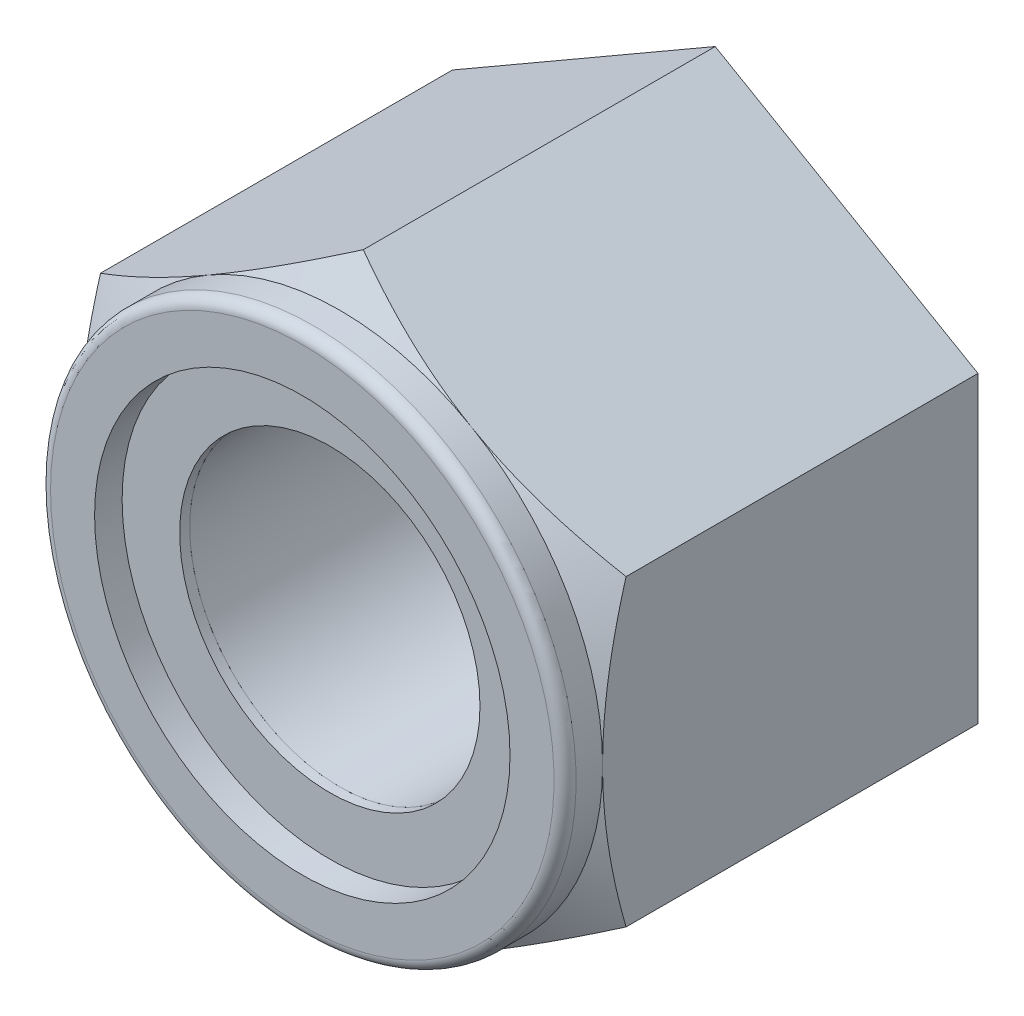
ISO-10303-21;
HEADER;
FILE_DESCRIPTION(('STEP AP214'),'2;1');
FILE_NAME('part.step','',(''),(''),'','','');
FILE_SCHEMA(('AUTOMOTIVE_DESIGN { 1 0 10303 214 1 1 1 1 }'));
ENDSEC;
DATA;
#1=APPLICATION_CONTEXT('core data for automotive mechanical design processes');
#2=APPLICATION_PROTOCOL_DEFINITION('international standard','automotive_design',2000,#1);
#3=PRODUCT_CONTEXT('',#1,'mechanical');
#4=PRODUCT('Part','Part','',(#3));
#5=PRODUCT_RELATED_PRODUCT_CATEGORY('part','',(#4));
#6=PRODUCT_DEFINITION_FORMATION('','',#4);
#7=PRODUCT_DEFINITION_CONTEXT('part definition',#1,'design');
#8=PRODUCT_DEFINITION('design','',#6,#7);
#9=PRODUCT_DEFINITION_SHAPE('','',#8);
#10=(LENGTH_UNIT() NAMED_UNIT(*) SI_UNIT(.MILLI.,.METRE.));
#11=(NAMED_UNIT(*) PLANE_ANGLE_UNIT() SI_UNIT($,.RADIAN.));
#12=(NAMED_UNIT(*) SI_UNIT($,.STERADIAN.) SOLID_ANGLE_UNIT());
#13=UNCERTAINTY_MEASURE_WITH_UNIT(LENGTH_MEASURE(1.E-05),#10,'distance_accuracy_value','');
#14=(GEOMETRIC_REPRESENTATION_CONTEXT(3) GLOBAL_UNCERTAINTY_ASSIGNED_CONTEXT((#13)) GLOBAL_UNIT_ASSIGNED_CONTEXT((#10,
#11,#12)) REPRESENTATION_CONTEXT('',''));
#15=CARTESIAN_POINT('',(0.,0.,0.));
#16=DIRECTION('',(0.,0.,1.));
#17=DIRECTION('',(1.,0.,0.));
#18=AXIS2_PLACEMENT_3D('',#15,#16,#17);
#19=CARTESIAN_POINT('',(0.,0.,13.9957383242047));
#20=DIRECTION('',(0.,0.,-1.));
#21=DIRECTION('',(-1.,0.,0.));
#22=AXIS2_PLACEMENT_3D('',#19,#20,#21);
#23=CYLINDRICAL_SURFACE('',#22,3.13333333333333);
#24=CARTESIAN_POINT('',(0.,0.,5.));
#25=DIRECTION('',(0.,0.,1.));
#26=DIRECTION('',(1.,0.,0.));
#27=AXIS2_PLACEMENT_3D('',#24,#25,#26);
#28=CIRCLE('',#27,3.13333333333333);
#29=CARTESIAN_POINT('',(3.13333333333333,0.,5.));
#30=VERTEX_POINT('',#29);
#31=EDGE_CURVE('E61',#30,#30,#28,.T.);
#32=ORIENTED_EDGE('',*,*,#31,.T.);
#33=EDGE_LOOP('',(#32));
#34=FACE_BOUND('',#33,.T.);
#35=CARTESIAN_POINT('',(0.,0.,5.13333333333333));
#36=DIRECTION('',(0.,0.,1.));
#37=DIRECTION('',(1.,0.,0.));
#38=AXIS2_PLACEMENT_3D('',#35,#36,#37);
#39=CIRCLE('',#38,3.13333333333333);
#40=CARTESIAN_POINT('',(3.13333333333333,0.,5.13333333333333));
#41=VERTEX_POINT('',#40);
#42=EDGE_CURVE('E11',#41,#41,#39,.T.);
#43=ORIENTED_EDGE('',*,*,#42,.F.);
#44=EDGE_LOOP('',(#43));
#45=FACE_BOUND('',#44,.T.);
#46=ADVANCED_FACE('F53',(#34,#45),#23,.T.);
#47=CARTESIAN_POINT('',(0.,0.,5.));
#48=DIRECTION('',(0.,0.,1.));
#49=DIRECTION('',(1.,0.,0.));
#50=AXIS2_PLACEMENT_3D('',#47,#48,#49);
#51=PLANE('',#50);
#52=ORIENTED_EDGE('',*,*,#31,.F.);
#53=EDGE_LOOP('',(#52));
#54=FACE_BOUND('',#53,.T.);
#55=CARTESIAN_POINT('',(0.,0.,5.));
#56=DIRECTION('',(0.,0.,1.));
#57=DIRECTION('',(1.,0.,0.));
#58=AXIS2_PLACEMENT_3D('',#55,#56,#57);
#59=CIRCLE('',#58,2.);
#60=CARTESIAN_POINT('',(2.,0.,5.));
#61=VERTEX_POINT('',#60);
#62=EDGE_CURVE('E68',#61,#61,#59,.T.);
#63=ORIENTED_EDGE('',*,*,#62,.T.);
#64=EDGE_LOOP('',(#63));
#65=FACE_BOUND('',#64,.T.);
#66=ADVANCED_FACE('F84',(#54,#65),#51,.F.);
#67=CARTESIAN_POINT('',(0.,0.,13.9957383242047));
#68=DIRECTION('',(0.,0.,-1.));
#69=DIRECTION('',(-1.,0.,0.));
#70=AXIS2_PLACEMENT_3D('',#67,#68,#69);
#71=CYLINDRICAL_SURFACE('',#70,2.);
#72=ORIENTED_EDGE('',*,*,#62,.F.);
#73=EDGE_LOOP('',(#72));
#74=FACE_BOUND('',#73,.T.);
#75=CARTESIAN_POINT('',(0.,0.,5.13333333333333));
#76=DIRECTION('',(0.,0.,1.));
#77=DIRECTION('',(1.,0.,0.));
#78=AXIS2_PLACEMENT_3D('',#75,#76,#77);
#79=CIRCLE('',#78,2.);
#80=CARTESIAN_POINT('',(2.,0.,5.13333333333333));
#81=VERTEX_POINT('',#80);
#82=EDGE_CURVE('E56',#81,#81,#79,.T.);
#83=ORIENTED_EDGE('',*,*,#82,.T.);
#84=EDGE_LOOP('',(#83));
#85=FACE_BOUND('',#84,.T.);
#86=ADVANCED_FACE('F77',(#74,#85),#71,.F.);
#87=CARTESIAN_POINT('',(2.76666666666667,0.,5.13333333333333));
#88=DIRECTION('',(0.,0.,1.));
#89=DIRECTION('',(1.,0.,0.));
#90=AXIS2_PLACEMENT_3D('',#87,#88,#89);
#91=PLANE('',#90);
#92=ORIENTED_EDGE('',*,*,#82,.F.);
#93=EDGE_LOOP('',(#92));
#94=FACE_BOUND('',#93,.T.);
#95=ORIENTED_EDGE('',*,*,#42,.T.);
#96=EDGE_LOOP('',(#95));
#97=FACE_BOUND('',#96,.T.);
#98=ADVANCED_FACE('F79',(#94,#97),#91,.T.);
#99=CLOSED_SHELL('',(#46,#66,#86,#98));
#100=MANIFOLD_SOLID_BREP('B2',#99);
#101=CARTESIAN_POINT('',(3.5,2.02072594216369,5.));
#102=DIRECTION('',(-0.5,-0.866025403784439,0.));
#103=DIRECTION('',(0.866025403784439,-0.5,0.));
#104=AXIS2_PLACEMENT_3D('',#101,#102,#103);
#105=PLANE('',#104);
#106=CARTESIAN_POINT('',(3.5002,2.02061047210985,4.68732593930663));
#107=CARTESIAN_POINT('',(3.34639282154755,2.10941108799267,4.73861421101002));
#108=CARTESIAN_POINT('',(3.19125798916558,2.19897822522909,4.78525904618381));
#109=CARTESIAN_POINT('',(2.87830199342322,2.37966345361545,4.86667812446665));
#110=CARTESIAN_POINT('',(2.7204752692125,2.47078475532382,4.90142356441544));
#111=CARTESIAN_POINT('',(2.40677778961987,2.65189807961073,4.95550997281716));
#112=CARTESIAN_POINT('',(2.25095530083931,2.74186223545399,4.97521091373962));
#113=CARTESIAN_POINT('',(1.93857711279463,2.92221386641055,4.99872986726275));
#114=CARTESIAN_POINT('',(1.78202254896577,3.01260068598001,5.00256735545443));
#115=CARTESIAN_POINT('',(1.48949078007901,3.1814939814933,4.99458469812302));
#116=CARTESIAN_POINT('',(1.3534697875421,3.26002573814993,4.98472456593039));
#117=CARTESIAN_POINT('',(1.08231397971101,3.41657761679354,4.9534735331006));
#118=CARTESIAN_POINT('',(0.947180102315319,3.49459719728457,4.9320719567142));
#119=CARTESIAN_POINT('',(0.675465207594818,3.65147186489429,4.87856959211942));
#120=CARTESIAN_POINT('',(0.538918580721666,3.73030709667644,4.84624200555491));
#121=CARTESIAN_POINT('',(0.2678619070555,3.88680174018324,4.77287106619201));
#122=CARTESIAN_POINT('',(0.133348387531464,3.96446315689009,4.73184495343014));
#123=CARTESIAN_POINT('',(-0.000199999999999256,4.04156735438122,4.68732593930663));
#124=B_SPLINE_CURVE_WITH_KNOTS('',3,(#106,#107,#108,#109,#110,#111,#112,#113,#114,#115,#116,
#117,#118,#119,#120,#121,#122,#123),.UNSPECIFIED.,.F.,.F.,(4,2,2,2,2,2,2,2,4),(0.,
0.554793832886253,1.11092123814983,1.65328467083218,2.19498204478403,2.66665130850859,
3.13875761298267,3.62133612600509,4.10296698719187),.UNSPECIFIED.);
#125=CARTESIAN_POINT('',(3.5,2.02072594216369,4.68739260883036));
#126=VERTEX_POINT('',#125);
#127=CARTESIAN_POINT('',(1.75,3.03108891324553,5.));
#128=VERTEX_POINT('',#127);
#129=EDGE_CURVE('E191',#126,#128,#124,.T.);
#130=ORIENTED_EDGE('',*,*,#129,.F.);
#131=DIRECTION('',(0.,0.,-1.));
#132=VECTOR('',#131,1.);
#133=CARTESIAN_POINT('',(3.5,2.02072594216369,5.));
#134=LINE('',#133,#132);
#135=CARTESIAN_POINT('',(3.5,2.02072594216369,0.));
#136=VERTEX_POINT('',#135);
#137=EDGE_CURVE('E139',#126,#136,#134,.T.);
#138=ORIENTED_EDGE('',*,*,#137,.T.);
#139=DIRECTION('',(-0.866025403784438,0.5,0.));
#140=VECTOR('',#139,1.);
#141=CARTESIAN_POINT('',(3.5,2.02072594216369,0.));
#142=LINE('',#141,#140);
#143=CARTESIAN_POINT('',(0.,4.04145188432738,0.));
#144=VERTEX_POINT('',#143);
#145=EDGE_CURVE('E214',#136,#144,#142,.T.);
#146=ORIENTED_EDGE('',*,*,#145,.T.);
#147=DIRECTION('',(0.,0.,-1.));
#148=VECTOR('',#147,1.);
#149=CARTESIAN_POINT('',(0.,4.04145188432738,5.));
#150=LINE('',#149,#148);
#151=CARTESIAN_POINT('',(0.,4.04145188432738,4.68739260883036));
#152=VERTEX_POINT('',#151);
#153=EDGE_CURVE('E192',#152,#144,#150,.T.);
#154=ORIENTED_EDGE('',*,*,#153,.F.);
#155=EDGE_CURVE('E188',#128,#152,#124,.T.);
#156=ORIENTED_EDGE('',*,*,#155,.F.);
#157=EDGE_LOOP('',(#130,#138,#146,#154,#156));
#158=FACE_BOUND('',#157,.T.);
#159=ADVANCED_FACE('F115',(#158),#105,.F.);
#160=CARTESIAN_POINT('',(0.,4.04145188432738,5.));
#161=DIRECTION('',(0.5,-0.866025403784439,0.));
#162=DIRECTION('',(0.866025403784439,0.5,0.));
#163=AXIS2_PLACEMENT_3D('',#160,#161,#162);
#164=PLANE('',#163);
#165=CARTESIAN_POINT('',(0.000200000000000673,4.04156735438122,4.68732593930663));
#166=CARTESIAN_POINT('',(-0.153607178452449,3.9527667384984,4.73861421101002));
#167=CARTESIAN_POINT('',(-0.308742010834423,3.86319960126198,4.78525904618381));
#168=CARTESIAN_POINT('',(-0.62169800657678,3.68251437287562,4.86667812446665));
#169=CARTESIAN_POINT('',(-0.779524730787494,3.59139307116725,4.90142356441544));
#170=CARTESIAN_POINT('',(-1.09322221038013,3.41027974688034,4.95550997281716));
#171=CARTESIAN_POINT('',(-1.24904469916069,3.32031559103708,4.97521091373962));
#172=CARTESIAN_POINT('',(-1.56142288720537,3.13996396008052,4.99872986726275));
#173=CARTESIAN_POINT('',(-1.71797745103423,3.04957714051106,5.00256735545444));
#174=CARTESIAN_POINT('',(-2.01050921992099,2.88068384499777,4.99458469812302));
#175=CARTESIAN_POINT('',(-2.1465302124579,2.80215208834115,4.98472456593039));
#176=CARTESIAN_POINT('',(-2.41768602028899,2.64560020969754,4.9534735331006));
#177=CARTESIAN_POINT('',(-2.55281989768468,2.5675806292065,4.9320719567142));
#178=CARTESIAN_POINT('',(-2.82453479240518,2.41070596159679,4.87856959211943));
#179=CARTESIAN_POINT('',(-2.96108141927834,2.33187072981464,4.84624200555492));
#180=CARTESIAN_POINT('',(-3.2321380929445,2.17537608630783,4.77287106619201));
#181=CARTESIAN_POINT('',(-3.36665161246854,2.09771466960098,4.73184495343014));
#182=CARTESIAN_POINT('',(-3.5002,2.02061047210985,4.68732593930663));
#183=B_SPLINE_CURVE_WITH_KNOTS('',3,(#165,#166,#167,#168,#169,#170,#171,#172,#173,#174,#175,
#176,#177,#178,#179,#180,#181,#182),.UNSPECIFIED.,.F.,.F.,(4,2,2,2,2,2,2,2,4),(0.,
0.554793832886252,1.11092123814983,1.65328467083218,2.19498204478403,2.6666513085086,
3.13875761298267,3.62133612600509,4.10296698719187),.UNSPECIFIED.);
#184=CARTESIAN_POINT('',(-1.75,3.03108891324554,5.));
#185=VERTEX_POINT('',#184);
#186=EDGE_CURVE('E196',#152,#185,#183,.T.);
#187=ORIENTED_EDGE('',*,*,#186,.F.);
#188=ORIENTED_EDGE('',*,*,#153,.T.);
#189=DIRECTION('',(-0.866025403784439,-0.5,0.));
#190=VECTOR('',#189,1.);
#191=CARTESIAN_POINT('',(0.,4.04145188432738,0.));
#192=LINE('',#191,#190);
#193=CARTESIAN_POINT('',(-3.5,2.02072594216369,0.));
#194=VERTEX_POINT('',#193);
#195=EDGE_CURVE('E266',#144,#194,#192,.T.);
#196=ORIENTED_EDGE('',*,*,#195,.T.);
#197=DIRECTION('',(0.,0.,-1.));
#198=VECTOR('',#197,1.);
#199=CARTESIAN_POINT('',(-3.5,2.02072594216369,5.));
#200=LINE('',#199,#198);
#201=CARTESIAN_POINT('',(-3.5,2.02072594216369,4.68739260883036));
#202=VERTEX_POINT('',#201);
#203=EDGE_CURVE('E232',#202,#194,#200,.T.);
#204=ORIENTED_EDGE('',*,*,#203,.F.);
#205=EDGE_CURVE('E276',#185,#202,#183,.T.);
#206=ORIENTED_EDGE('',*,*,#205,.F.);
#207=EDGE_LOOP('',(#187,#188,#196,#204,#206));
#208=FACE_BOUND('',#207,.T.);
#209=ADVANCED_FACE('F332',(#208),#164,.F.);
#210=CARTESIAN_POINT('',(-3.5,2.02072594216369,5.));
#211=DIRECTION('',(1.,0.,0.));
#212=DIRECTION('',(0.,0.,-1.));
#213=AXIS2_PLACEMENT_3D('',#210,#211,#212);
#214=PLANE('',#213);
#215=CARTESIAN_POINT('',(-3.5,-5.42832118913325,3.29171039145005));
#216=CARTESIAN_POINT('',(-3.5,-5.27545296559796,3.36586681134376));
#217=CARTESIAN_POINT('',(-3.5,-5.12223387181038,3.43931232069952));
#218=CARTESIAN_POINT('',(-3.5,-4.81490736341447,3.58438170980516));
#219=CARTESIAN_POINT('',(-3.5,-4.66079981349271,3.65600530257477));
#220=CARTESIAN_POINT('',(-3.5,-4.35071597154945,3.79739131146016));
#221=CARTESIAN_POINT('',(-3.5,-4.19473407359317,3.86714147525076));
#222=CARTESIAN_POINT('',(-3.5,-3.88152983040295,4.00378804742818));
#223=CARTESIAN_POINT('',(-3.5,-3.72430754417264,4.07068459059961));
#224=CARTESIAN_POINT('',(-3.5,-3.40328935619205,4.20296515879934));
#225=CARTESIAN_POINT('',(-3.5,-3.23944464294745,4.2682313748369));
#226=CARTESIAN_POINT('',(-3.5,-2.90983843166277,4.39382518009215));
#227=CARTESIAN_POINT('',(-3.5,-2.74407672088104,4.45415221505661));
#228=CARTESIAN_POINT('',(-3.5,-2.4106830047955,4.56828423611488));
#229=CARTESIAN_POINT('',(-3.5,-2.24305556435996,4.62210242283747));
#230=CARTESIAN_POINT('',(-3.5,-1.90539605132121,4.72148999156981));
#231=CARTESIAN_POINT('',(-3.5,-1.73536475427334,4.7670619714017));
#232=CARTESIAN_POINT('',(-3.5,-1.3937488255673,4.84752681416907));
#233=CARTESIAN_POINT('',(-3.5,-1.2221781450605,4.88247781632996));
#234=CARTESIAN_POINT('',(-3.5,-0.876902520257989,4.93972691489234));
#235=CARTESIAN_POINT('',(-3.5,-0.703197778969184,4.96202620543696));
#236=CARTESIAN_POINT('',(-3.5,-0.356790549769858,4.99190119436236));
#237=CARTESIAN_POINT('',(-3.5,-0.184104797554878,4.99966616694187));
#238=CARTESIAN_POINT('',(-3.5,0.161308535217046,5.00031240227325));
#239=CARTESIAN_POINT('',(-3.5,0.334036116477546,4.99319339435635));
#240=CARTESIAN_POINT('',(-3.5,0.627267326173035,4.96897680945658));
#241=CARTESIAN_POINT('',(-3.5,0.748084592119676,4.95545973305487));
#242=CARTESIAN_POINT('',(-3.5,0.988829654945528,4.92198482243021));
#243=CARTESIAN_POINT('',(-3.5,1.10875732862451,4.90202611252953));
#244=CARTESIAN_POINT('',(-3.5,1.46704957292925,4.83353706741905));
#245=CARTESIAN_POINT('',(-3.5,1.70378822015516,4.7764064562308));
#246=CARTESIAN_POINT('',(-3.5,2.05776701423679,4.67740724469126));
#247=CARTESIAN_POINT('',(-3.5,2.17684391874892,4.64173259939028));
#248=CARTESIAN_POINT('',(-3.5,2.41384088896862,4.56669445557482));
#249=CARTESIAN_POINT('',(-3.5,2.53176094710896,4.52733093294823));
#250=CARTESIAN_POINT('',(-3.5,2.766481805821,4.44554533760541));
#251=CARTESIAN_POINT('',(-3.5,2.88328296524103,4.40312428541469));
#252=CARTESIAN_POINT('',(-3.5,3.11591877969283,4.31572104522802));
#253=CARTESIAN_POINT('',(-3.5,3.23175344542175,4.27073888562164));
#254=CARTESIAN_POINT('',(-3.5,3.50250396629017,4.16270144014859));
#255=CARTESIAN_POINT('',(-3.5,3.65707293002751,4.09877848349487));
#256=CARTESIAN_POINT('',(-3.5,3.96491389227385,3.96787401451323));
#257=CARTESIAN_POINT('',(-3.5,4.11818581545299,3.900892325965));
#258=CARTESIAN_POINT('',(-3.5,4.42366804952573,3.76447749635459));
#259=CARTESIAN_POINT('',(-3.5,4.57587814642353,3.69504387731232));
#260=CARTESIAN_POINT('',(-3.5,4.87938544499878,3.55420636139757));
#261=CARTESIAN_POINT('',(-3.5,5.03068262745959,3.48280242322544));
#262=CARTESIAN_POINT('',(-3.5,5.48372223978274,3.2660644548937));
#263=CARTESIAN_POINT('',(-3.5,5.7843190764,3.11833722055126));
#264=CARTESIAN_POINT('',(-3.5,6.38334266368291,2.81854820970694));
#265=CARTESIAN_POINT('',(-3.5,6.68176933504329,2.66648627578943));
#266=CARTESIAN_POINT('',(-3.5,7.25244094865376,2.37196445508918));
#267=CARTESIAN_POINT('',(-3.5,7.52481228087437,2.2297490067426));
#268=CARTESIAN_POINT('',(-3.5,8.06853467836357,1.94336175742024));
#269=CARTESIAN_POINT('',(-3.5,8.33988570841331,1.79918988969018));
#270=CARTESIAN_POINT('',(-3.5,8.88112631398284,1.50970630064993));
#271=CARTESIAN_POINT('',(-3.5,9.15101784013932,1.36439822166078));
#272=CARTESIAN_POINT('',(-3.5,9.69014679451159,1.07260789440721));
#273=CARTESIAN_POINT('',(-3.5,9.95938425738873,0.926125710213653));
#274=CARTESIAN_POINT('',(-3.5,10.22838027119,0.779204680695816));
#275=B_SPLINE_CURVE_WITH_KNOTS('',3,(#215,#216,#217,#218,#219,#220,#221,#222,#223,#224,#225,
#226,#227,#228,#229,#230,#231,#232,#233,#234,#235,#236,#237,#238,#239,#240,#241,#242,#243,#244,
#245,#246,#247,#248,#249,#250,#251,#252,#253,#254,#255,#256,#257,#258,#259,#260,#261,#262,#263,
#264,#265,#266,#267,#268,#269,#270,#271,#272,#273,#274),.UNSPECIFIED.,.F.,.F.,(4,2,2,2,2,2,2,2,
2,2,2,2,2,2,2,2,2,2,2,2,2,2,2,2,2,2,2,2,2,4),(0.,0.50972263313,1.01952506448884,
1.53210235091663,2.04465539999535,2.57369018196405,3.10278424875902,3.6307865927486,
4.15862230820676,4.68351432474782,5.20835679064084,5.72631558241929,6.24428379348549,
6.60882010576362,6.97340599411287,7.70298313355719,8.07586982851781,8.44875896099962,
8.82152420385834,9.19428531546514,9.69603737941263,10.1978183869632,10.6996977577758,
11.2015876564367,12.2063342834818,13.2111174447338,14.1328999845748,15.0547140557038,
15.9742775321602,16.8937911651733),.UNSPECIFIED.);
#276=CARTESIAN_POINT('',(-3.5,0.,5.));
#277=VERTEX_POINT('',#276);
#278=EDGE_CURVE('E326',#202,#277,#275,.F.);
#279=ORIENTED_EDGE('',*,*,#278,.F.);
#280=ORIENTED_EDGE('',*,*,#203,.T.);
#281=DIRECTION('',(0.,-1.,0.));
#282=VECTOR('',#281,1.);
#283=CARTESIAN_POINT('',(-3.5,2.02072594216369,0.));
#284=LINE('',#283,#282);
#285=CARTESIAN_POINT('',(-3.5,-2.02072594216369,0.));
#286=VERTEX_POINT('',#285);
#287=EDGE_CURVE('E262',#194,#286,#284,.T.);
#288=ORIENTED_EDGE('',*,*,#287,.T.);
#289=DIRECTION('',(0.,0.,-1.));
#290=VECTOR('',#289,1.);
#291=CARTESIAN_POINT('',(-3.5,-2.02072594216369,5.));
#292=LINE('',#291,#290);
#293=CARTESIAN_POINT('',(-3.5,-2.02072594216369,4.68739260883036));
#294=VERTEX_POINT('',#293);
#295=EDGE_CURVE('E238',#294,#286,#292,.T.);
#296=ORIENTED_EDGE('',*,*,#295,.F.);
#297=EDGE_CURVE('E319',#277,#294,#275,.F.);
#298=ORIENTED_EDGE('',*,*,#297,.F.);
#299=EDGE_LOOP('',(#279,#280,#288,#296,#298));
#300=FACE_BOUND('',#299,.T.);
#301=ADVANCED_FACE('F328',(#300),#214,.F.);
#302=CARTESIAN_POINT('',(-3.5,-2.02072594216369,5.));
#303=DIRECTION('',(0.5,0.866025403784439,0.));
#304=DIRECTION('',(-0.866025403784439,0.5,0.));
#305=AXIS2_PLACEMENT_3D('',#302,#303,#304);
#306=PLANE('',#305);
#307=CARTESIAN_POINT('',(-3.5002,-2.02061047210985,4.68732593930663));
#308=CARTESIAN_POINT('',(-3.34639282154755,-2.10941108799267,4.73861421101002));
#309=CARTESIAN_POINT('',(-3.19125798916558,-2.19897822522909,4.78525904618381));
#310=CARTESIAN_POINT('',(-2.87830199342322,-2.37966345361545,4.86667812446665));
#311=CARTESIAN_POINT('',(-2.72047526921251,-2.47078475532382,4.90142356441544));
#312=CARTESIAN_POINT('',(-2.40677778961987,-2.65189807961074,4.95550997281716));
#313=CARTESIAN_POINT('',(-2.25095530083931,-2.74186223545399,4.97521091373962));
#314=CARTESIAN_POINT('',(-1.93857711279463,-2.92221386641056,4.99872986726275));
#315=CARTESIAN_POINT('',(-1.78202254896577,-3.01260068598001,5.00256735545443));
#316=CARTESIAN_POINT('',(-1.48949078007901,-3.1814939814933,4.99458469812302));
#317=CARTESIAN_POINT('',(-1.3534697875421,-3.26002573814993,4.98472456593039));
#318=CARTESIAN_POINT('',(-1.08231397971101,-3.41657761679354,4.9534735331006));
#319=CARTESIAN_POINT('',(-0.947180102315319,-3.49459719728458,4.9320719567142));
#320=CARTESIAN_POINT('',(-0.675465207594817,-3.65147186489429,4.87856959211942));
#321=CARTESIAN_POINT('',(-0.538918580721665,-3.73030709667644,4.84624200555491));
#322=CARTESIAN_POINT('',(-0.267861907055499,-3.88680174018324,4.77287106619201));
#323=CARTESIAN_POINT('',(-0.133348387531464,-3.96446315689009,4.73184495343014));
#324=CARTESIAN_POINT('',(0.000199999999999431,-4.04156735438122,4.68732593930663));
#325=B_SPLINE_CURVE_WITH_KNOTS('',3,(#307,#308,#309,#310,#311,#312,#313,#314,#315,#316,#317,
#318,#319,#320,#321,#322,#323,#324),.UNSPECIFIED.,.F.,.F.,(4,2,2,2,2,2,2,2,4),(0.,
0.554793832886253,1.11092123814983,1.65328467083218,2.19498204478403,2.6666513085086,
3.13875761298267,3.62133612600509,4.10296698719187),.UNSPECIFIED.);
#326=CARTESIAN_POINT('',(-1.75,-3.03108891324553,5.));
#327=VERTEX_POINT('',#326);
#328=EDGE_CURVE('E327',#294,#327,#325,.T.);
#329=ORIENTED_EDGE('',*,*,#328,.F.);
#330=ORIENTED_EDGE('',*,*,#295,.T.);
#331=DIRECTION('',(0.866025403784439,-0.5,0.));
#332=VECTOR('',#331,1.);
#333=CARTESIAN_POINT('',(-3.5,-2.02072594216369,0.));
#334=LINE('',#333,#332);
#335=CARTESIAN_POINT('',(0.,-4.04145188432738,0.));
#336=VERTEX_POINT('',#335);
#337=EDGE_CURVE('E258',#286,#336,#334,.T.);
#338=ORIENTED_EDGE('',*,*,#337,.T.);
#339=DIRECTION('',(0.,0.,-1.));
#340=VECTOR('',#339,1.);
#341=CARTESIAN_POINT('',(0.,-4.04145188432738,5.));
#342=LINE('',#341,#340);
#343=CARTESIAN_POINT('',(0.,-4.04145188432738,4.68739260883036));
#344=VERTEX_POINT('',#343);
#345=EDGE_CURVE('E243',#344,#336,#342,.T.);
#346=ORIENTED_EDGE('',*,*,#345,.F.);
#347=EDGE_CURVE('E313',#327,#344,#325,.T.);
#348=ORIENTED_EDGE('',*,*,#347,.F.);
#349=EDGE_LOOP('',(#329,#330,#338,#346,#348));
#350=FACE_BOUND('',#349,.T.);
#351=ADVANCED_FACE('F331',(#350),#306,.F.);
#352=CARTESIAN_POINT('',(0.,-4.04145188432738,5.));
#353=DIRECTION('',(-0.5,0.866025403784439,0.));
#354=DIRECTION('',(-0.866025403784439,-0.5,0.));
#355=AXIS2_PLACEMENT_3D('',#352,#353,#354);
#356=PLANE('',#355);
#357=CARTESIAN_POINT('',(-0.000200000000001014,-4.04156735438122,4.68732593930663));
#358=CARTESIAN_POINT('',(0.153607178452449,-3.9527667384984,4.73861421101002));
#359=CARTESIAN_POINT('',(0.308742010834423,-3.86319960126198,4.78525904618381));
#360=CARTESIAN_POINT('',(0.62169800657678,-3.68251437287562,4.86667812446665));
#361=CARTESIAN_POINT('',(0.779524730787494,-3.59139307116725,4.90142356441544));
#362=CARTESIAN_POINT('',(1.09322221038013,-3.41027974688034,4.95550997281716));
#363=CARTESIAN_POINT('',(1.24904469916069,-3.32031559103708,4.97521091373962));
#364=CARTESIAN_POINT('',(1.56142288720537,-3.13996396008052,4.99872986726275));
#365=CARTESIAN_POINT('',(1.71797745103423,-3.04957714051106,5.00256735545443));
#366=CARTESIAN_POINT('',(2.01050921992099,-2.88068384499778,4.99458469812302));
#367=CARTESIAN_POINT('',(2.1465302124579,-2.80215208834115,4.98472456593039));
#368=CARTESIAN_POINT('',(2.41768602028899,-2.64560020969754,4.9534735331006));
#369=CARTESIAN_POINT('',(2.55281989768468,-2.5675806292065,4.9320719567142));
#370=CARTESIAN_POINT('',(2.82453479240518,-2.41070596159679,4.87856959211942));
#371=CARTESIAN_POINT('',(2.96108141927833,-2.33187072981464,4.84624200555491));
#372=CARTESIAN_POINT('',(3.2321380929445,-2.17537608630783,4.77287106619201));
#373=CARTESIAN_POINT('',(3.36665161246854,-2.09771466960099,4.73184495343014));
#374=CARTESIAN_POINT('',(3.5002,-2.02061047210986,4.68732593930663));
#375=B_SPLINE_CURVE_WITH_KNOTS('',3,(#357,#358,#359,#360,#361,#362,#363,#364,#365,#366,#367,
#368,#369,#370,#371,#372,#373,#374),.UNSPECIFIED.,.F.,.F.,(4,2,2,2,2,2,2,2,4),(0.,
0.554793832886253,1.11092123814983,1.65328467083218,2.19498204478403,2.6666513085086,
3.13875761298267,3.62133612600509,4.10296698719187),.UNSPECIFIED.);
#376=CARTESIAN_POINT('',(1.75,-3.03108891324553,5.));
#377=VERTEX_POINT('',#376);
#378=EDGE_CURVE('E544',#344,#377,#375,.T.);
#379=ORIENTED_EDGE('',*,*,#378,.F.);
#380=ORIENTED_EDGE('',*,*,#345,.T.);
#381=DIRECTION('',(0.866025403784439,0.5,0.));
#382=VECTOR('',#381,1.);
#383=CARTESIAN_POINT('',(0.,-4.04145188432738,0.));
#384=LINE('',#383,#382);
#385=CARTESIAN_POINT('',(3.5,-2.02072594216369,0.));
#386=VERTEX_POINT('',#385);
#387=EDGE_CURVE('E254',#336,#386,#384,.T.);
#388=ORIENTED_EDGE('',*,*,#387,.T.);
#389=DIRECTION('',(0.,0.,-1.));
#390=VECTOR('',#389,1.);
#391=CARTESIAN_POINT('',(3.5,-2.02072594216369,5.));
#392=LINE('',#391,#390);
#393=CARTESIAN_POINT('',(3.5,-2.02072594216424,4.68739260883073));
#394=VERTEX_POINT('',#393);
#395=EDGE_CURVE('E246',#394,#386,#392,.T.);
#396=ORIENTED_EDGE('',*,*,#395,.F.);
#397=EDGE_CURVE('E305',#377,#394,#375,.T.);
#398=ORIENTED_EDGE('',*,*,#397,.F.);
#399=EDGE_LOOP('',(#379,#380,#388,#396,#398));
#400=FACE_BOUND('',#399,.T.);
#401=ADVANCED_FACE('F510',(#400),#356,.F.);
#402=CARTESIAN_POINT('',(3.5,-2.02072594216369,5.));
#403=DIRECTION('',(-1.,0.,0.));
#404=DIRECTION('',(0.,0.,1.));
#405=AXIS2_PLACEMENT_3D('',#402,#403,#404);
#406=PLANE('',#405);
#407=CARTESIAN_POINT('',(3.5,-5.42832118913325,3.29171039145005));
#408=CARTESIAN_POINT('',(3.5,-5.27545296559796,3.36586681134376));
#409=CARTESIAN_POINT('',(3.5,-5.12223387181038,3.43931232069952));
#410=CARTESIAN_POINT('',(3.5,-4.81490736341447,3.58438170980516));
#411=CARTESIAN_POINT('',(3.5,-4.66079981349271,3.65600530257477));
#412=CARTESIAN_POINT('',(3.5,-4.35071597154945,3.79739131146016));
#413=CARTESIAN_POINT('',(3.5,-4.19473407359317,3.86714147525076));
#414=CARTESIAN_POINT('',(3.5,-3.88152983040295,4.00378804742818));
#415=CARTESIAN_POINT('',(3.5,-3.72430754417264,4.07068459059961));
#416=CARTESIAN_POINT('',(3.5,-3.40328935619205,4.20296515879934));
#417=CARTESIAN_POINT('',(3.5,-3.23944464294745,4.2682313748369));
#418=CARTESIAN_POINT('',(3.5,-2.90983843166277,4.39382518009215));
#419=CARTESIAN_POINT('',(3.5,-2.74407672088104,4.45415221505661));
#420=CARTESIAN_POINT('',(3.5,-2.4106830047955,4.56828423611487));
#421=CARTESIAN_POINT('',(3.5,-2.24305556435996,4.62210242283747));
#422=CARTESIAN_POINT('',(3.5,-1.90539605132121,4.72148999156981));
#423=CARTESIAN_POINT('',(3.5,-1.73536475427334,4.7670619714017));
#424=CARTESIAN_POINT('',(3.5,-1.3937488255673,4.84752681416907));
#425=CARTESIAN_POINT('',(3.5,-1.2221781450605,4.88247781632996));
#426=CARTESIAN_POINT('',(3.5,-0.876902520257991,4.93972691489234));
#427=CARTESIAN_POINT('',(3.5,-0.703197778969187,4.96202620543696));
#428=CARTESIAN_POINT('',(3.5,-0.356790549769861,4.99190119436236));
#429=CARTESIAN_POINT('',(3.5,-0.184104797554881,4.99966616694187));
#430=CARTESIAN_POINT('',(3.5,0.161308535217043,5.00031240227325));
#431=CARTESIAN_POINT('',(3.5,0.334036116477543,4.99319339435635));
#432=CARTESIAN_POINT('',(3.5,0.627267326173032,4.96897680945658));
#433=CARTESIAN_POINT('',(3.5,0.748084592119672,4.95545973305487));
#434=CARTESIAN_POINT('',(3.5,0.988829654945525,4.92198482243021));
#435=CARTESIAN_POINT('',(3.5,1.1087573286245,4.90202611252953));
#436=CARTESIAN_POINT('',(3.5,1.46704957292924,4.83353706741905));
#437=CARTESIAN_POINT('',(3.5,1.70378822015516,4.7764064562308));
#438=CARTESIAN_POINT('',(3.5,2.05776701423679,4.67740724469127));
#439=CARTESIAN_POINT('',(3.5,2.17684391874892,4.64173259939028));
#440=CARTESIAN_POINT('',(3.5,2.41384088896861,4.56669445557483));
#441=CARTESIAN_POINT('',(3.5,2.53176094710895,4.52733093294824));
#442=CARTESIAN_POINT('',(3.5,2.76648180582099,4.44554533760541));
#443=CARTESIAN_POINT('',(3.5,2.88328296524102,4.40312428541469));
#444=CARTESIAN_POINT('',(3.5,3.11591877969282,4.31572104522803));
#445=CARTESIAN_POINT('',(3.5,3.23175344542174,4.27073888562164));
#446=CARTESIAN_POINT('',(3.5,3.50250396629017,4.16270144014859));
#447=CARTESIAN_POINT('',(3.5,3.6570729300275,4.09877848349488));
#448=CARTESIAN_POINT('',(3.5,3.96491389227384,3.96787401451323));
#449=CARTESIAN_POINT('',(3.5,4.11818581545298,3.90089232596501));
#450=CARTESIAN_POINT('',(3.5,4.42366804952573,3.76447749635459));
#451=CARTESIAN_POINT('',(3.5,4.57587814642353,3.69504387731232));
#452=CARTESIAN_POINT('',(3.5,4.87938544499877,3.55420636139758));
#453=CARTESIAN_POINT('',(3.5,5.03068262745958,3.48280242322544));
#454=CARTESIAN_POINT('',(3.5,5.48372223978273,3.2660644548937));
#455=CARTESIAN_POINT('',(3.5,5.78431907639999,3.11833722055126));
#456=CARTESIAN_POINT('',(3.5,6.3833426636829,2.81854820970694));
#457=CARTESIAN_POINT('',(3.5,6.68176933504328,2.66648627578944));
#458=CARTESIAN_POINT('',(3.5,7.25244094865375,2.37196445508918));
#459=CARTESIAN_POINT('',(3.5,7.52481228087436,2.2297490067426));
#460=CARTESIAN_POINT('',(3.5,8.06853467836356,1.94336175742024));
#461=CARTESIAN_POINT('',(3.5,8.33988570841331,1.79918988969018));
#462=CARTESIAN_POINT('',(3.5,8.88112631398283,1.50970630064993));
#463=CARTESIAN_POINT('',(3.5,9.15101784013932,1.36439822166078));
#464=CARTESIAN_POINT('',(3.5,9.69014679451158,1.07260789440722));
#465=CARTESIAN_POINT('',(3.5,9.95938425738873,0.926125710213653));
#466=CARTESIAN_POINT('',(3.5,10.22838027119,0.779204680695815));
#467=B_SPLINE_CURVE_WITH_KNOTS('',3,(#407,#408,#409,#410,#411,#412,#413,#414,#415,#416,#417,
#418,#419,#420,#421,#422,#423,#424,#425,#426,#427,#428,#429,#430,#431,#432,#433,#434,#435,#436,
#437,#438,#439,#440,#441,#442,#443,#444,#445,#446,#447,#448,#449,#450,#451,#452,#453,#454,#455,
#456,#457,#458,#459,#460,#461,#462,#463,#464,#465,#466),.UNSPECIFIED.,.F.,.F.,(4,2,2,2,2,2,2,2,
2,2,2,2,2,2,2,2,2,2,2,2,2,2,2,2,2,2,2,2,2,4),(0.,0.50972263313,1.01952506448884,
1.53210235091663,2.04465539999535,2.57369018196405,3.10278424875902,3.6307865927486,
4.15862230820676,4.68351432474782,5.20835679064083,5.72631558241929,6.24428379348549,
6.60882010576361,6.97340599411286,7.70298313355718,8.0758698285178,8.44875896099962,
8.82152420385833,9.19428531546512,9.69603737941262,10.1978183869632,10.6996977577758,
11.2015876564367,12.2063342834818,13.2111174447338,14.1328999845748,15.0547140557038,
15.9742775321602,16.8937911651733),.UNSPECIFIED.);
#468=CARTESIAN_POINT('',(3.5,0.,5.));
#469=VERTEX_POINT('',#468);
#470=EDGE_CURVE('E131',#394,#469,#467,.T.);
#471=ORIENTED_EDGE('',*,*,#470,.F.);
#472=ORIENTED_EDGE('',*,*,#395,.T.);
#473=DIRECTION('',(0.,1.,0.));
#474=VECTOR('',#473,1.);
#475=CARTESIAN_POINT('',(3.5,-2.02072594216369,0.));
#476=LINE('',#475,#474);
#477=EDGE_CURVE('E251',#386,#136,#476,.T.);
#478=ORIENTED_EDGE('',*,*,#477,.T.);
#479=ORIENTED_EDGE('',*,*,#137,.F.);
#480=EDGE_CURVE('E212',#469,#126,#467,.T.);
#481=ORIENTED_EDGE('',*,*,#480,.F.);
#482=EDGE_LOOP('',(#471,#472,#478,#479,#481));
#483=FACE_BOUND('',#482,.T.);
#484=ADVANCED_FACE('F454',(#483),#406,.F.);
#485=CARTESIAN_POINT('',(-3.5,6.06217782649107,0.));
#486=DIRECTION('',(0.,0.,1.));
#487=DIRECTION('',(1.,0.,0.));
#488=AXIS2_PLACEMENT_3D('',#485,#486,#487);
#489=PLANE('',#488);
#490=CARTESIAN_POINT('',(0.,0.,0.));
#491=DIRECTION('',(0.,0.,-1.));
#492=DIRECTION('',(-1.,0.,0.));
#493=AXIS2_PLACEMENT_3D('',#490,#491,#492);
#494=CIRCLE('',#493,2.);
#495=CARTESIAN_POINT('',(-2.,0.,0.));
#496=VERTEX_POINT('',#495);
#497=EDGE_CURVE('E373',#496,#496,#494,.T.);
#498=ORIENTED_EDGE('',*,*,#497,.F.);
#499=EDGE_LOOP('',(#498));
#500=FACE_BOUND('',#499,.T.);
#501=ORIENTED_EDGE('',*,*,#145,.F.);
#502=ORIENTED_EDGE('',*,*,#477,.F.);
#503=ORIENTED_EDGE('',*,*,#387,.F.);
#504=ORIENTED_EDGE('',*,*,#337,.F.);
#505=ORIENTED_EDGE('',*,*,#287,.F.);
#506=ORIENTED_EDGE('',*,*,#195,.F.);
#507=EDGE_LOOP('',(#501,#502,#503,#504,#505,#506));
#508=FACE_BOUND('',#507,.T.);
#509=ADVANCED_FACE('F449',(#500,#508),#489,.F.);
#510=CARTESIAN_POINT('',(0.,0.,4.19170962313454));
#511=DIRECTION('',(0.,0.,-1.));
#512=DIRECTION('',(-1.,0.,0.));
#513=AXIS2_PLACEMENT_3D('',#510,#511,#512);
#514=CONICAL_SURFACE('',#513,4.9,1.0471975511966);
#515=ORIENTED_EDGE('',*,*,#397,.T.);
#516=ORIENTED_EDGE('',*,*,#470,.T.);
#517=CARTESIAN_POINT('',(0.,0.,5.));
#518=DIRECTION('',(0.,0.,1.));
#519=DIRECTION('',(1.,0.,0.));
#520=AXIS2_PLACEMENT_3D('',#517,#518,#519);
#521=CIRCLE('',#520,3.5);
#522=EDGE_CURVE('E218',#377,#469,#521,.T.);
#523=ORIENTED_EDGE('',*,*,#522,.F.);
#524=EDGE_LOOP('',(#515,#516,#523));
#525=FACE_BOUND('',#524,.T.);
#526=ADVANCED_FACE('F289',(#525),#514,.T.);
#527=ORIENTED_EDGE('',*,*,#347,.T.);
#528=ORIENTED_EDGE('',*,*,#378,.T.);
#529=EDGE_CURVE('E227',#327,#377,#521,.T.);
#530=ORIENTED_EDGE('',*,*,#529,.F.);
#531=EDGE_LOOP('',(#527,#528,#530));
#532=FACE_BOUND('',#531,.T.);
#533=ADVANCED_FACE('F492',(#532),#514,.T.);
#534=ORIENTED_EDGE('',*,*,#297,.T.);
#535=ORIENTED_EDGE('',*,*,#328,.T.);
#536=EDGE_CURVE('E207',#277,#327,#521,.T.);
#537=ORIENTED_EDGE('',*,*,#536,.F.);
#538=EDGE_LOOP('',(#534,#535,#537));
#539=FACE_BOUND('',#538,.T.);
#540=ADVANCED_FACE('F351',(#539),#514,.T.);
#541=ORIENTED_EDGE('',*,*,#205,.T.);
#542=ORIENTED_EDGE('',*,*,#278,.T.);
#543=CARTESIAN_POINT('',(0.,0.,5.));
#544=DIRECTION('',(0.,0.,-1.));
#545=DIRECTION('',(-1.,0.,0.));
#546=AXIS2_PLACEMENT_3D('',#543,#544,#545);
#547=CIRCLE('',#546,3.5);
#548=EDGE_CURVE('E347',#277,#185,#547,.T.);
#549=ORIENTED_EDGE('',*,*,#548,.T.);
#550=EDGE_LOOP('',(#541,#542,#549));
#551=FACE_BOUND('',#550,.T.);
#552=ADVANCED_FACE('F346',(#551),#514,.T.);
#553=ORIENTED_EDGE('',*,*,#155,.T.);
#554=ORIENTED_EDGE('',*,*,#186,.T.);
#555=EDGE_CURVE('E199',#128,#185,#521,.T.);
#556=ORIENTED_EDGE('',*,*,#555,.F.);
#557=EDGE_LOOP('',(#553,#554,#556));
#558=FACE_BOUND('',#557,.T.);
#559=ADVANCED_FACE('F200',(#558),#514,.T.);
#560=ORIENTED_EDGE('',*,*,#129,.T.);
#561=EDGE_CURVE('E206',#469,#128,#521,.T.);
#562=ORIENTED_EDGE('',*,*,#561,.F.);
#563=ORIENTED_EDGE('',*,*,#480,.T.);
#564=EDGE_LOOP('',(#560,#562,#563));
#565=FACE_BOUND('',#564,.T.);
#566=ADVANCED_FACE('F210',(#565),#514,.T.);
#567=CARTESIAN_POINT('',(0.,0.,0.));
#568=DIRECTION('',(0.,0.,-1.));
#569=DIRECTION('',(-1.,0.,0.));
#570=AXIS2_PLACEMENT_3D('',#567,#568,#569);
#571=CYLINDRICAL_SURFACE('',#570,3.13333333333333);
#572=CARTESIAN_POINT('',(0.,0.,5.13333333333333));
#573=DIRECTION('',(0.,0.,-1.));
#574=DIRECTION('',(-1.,0.,0.));
#575=AXIS2_PLACEMENT_3D('',#572,#573,#574);
#576=CIRCLE('',#575,3.13333333333333);
#577=CARTESIAN_POINT('',(-3.13333333333333,0.,5.13333333333333));
#578=VERTEX_POINT('',#577);
#579=EDGE_CURVE('E359',#578,#578,#576,.T.);
#580=ORIENTED_EDGE('',*,*,#579,.F.);
#581=EDGE_LOOP('',(#580));
#582=FACE_BOUND('',#581,.T.);
#583=CARTESIAN_POINT('',(0.,0.,5.));
#584=DIRECTION('',(0.,0.,-1.));
#585=DIRECTION('',(-1.,0.,0.));
#586=AXIS2_PLACEMENT_3D('',#583,#584,#585);
#587=CIRCLE('',#586,3.13333333333333);
#588=CARTESIAN_POINT('',(-3.13333333333333,0.,5.));
#589=VERTEX_POINT('',#588);
#590=EDGE_CURVE('E356',#589,#589,#587,.T.);
#591=ORIENTED_EDGE('',*,*,#590,.T.);
#592=EDGE_LOOP('',(#591));
#593=FACE_BOUND('',#592,.T.);
#594=ADVANCED_FACE('F288',(#582,#593),#571,.F.);
#595=CARTESIAN_POINT('',(2.76666666666667,0.,5.13333333333333));
#596=DIRECTION('',(0.,0.,1.));
#597=DIRECTION('',(1.,0.,0.));
#598=AXIS2_PLACEMENT_3D('',#595,#596,#597);
#599=PLANE('',#598);
#600=CARTESIAN_POINT('',(0.,0.,5.13333333333333));
#601=DIRECTION('',(0.,0.,-1.));
#602=DIRECTION('',(-1.,0.,0.));
#603=AXIS2_PLACEMENT_3D('',#600,#601,#602);
#604=CIRCLE('',#603,2.76666666666667);
#605=CARTESIAN_POINT('',(-2.76666666666667,0.,5.13333333333333));
#606=VERTEX_POINT('',#605);
#607=EDGE_CURVE('E364',#606,#606,#604,.T.);
#608=ORIENTED_EDGE('',*,*,#607,.F.);
#609=EDGE_LOOP('',(#608));
#610=FACE_BOUND('',#609,.T.);
#611=ORIENTED_EDGE('',*,*,#579,.T.);
#612=EDGE_LOOP('',(#611));
#613=FACE_BOUND('',#612,.T.);
#614=ADVANCED_FACE('F390',(#610,#613),#599,.F.);
#615=CARTESIAN_POINT('',(0.,0.,0.));
#616=DIRECTION('',(0.,0.,-1.));
#617=DIRECTION('',(-1.,0.,0.));
#618=AXIS2_PLACEMENT_3D('',#615,#616,#617);
#619=CYLINDRICAL_SURFACE('',#618,2.76666666666667);
#620=CARTESIAN_POINT('',(0.,0.,5.5));
#621=DIRECTION('',(0.,0.,-1.));
#622=DIRECTION('',(-1.,0.,0.));
#623=AXIS2_PLACEMENT_3D('',#620,#621,#622);
#624=CIRCLE('',#623,2.76666666666667);
#625=CARTESIAN_POINT('',(-2.76666666666667,0.,5.5));
#626=VERTEX_POINT('',#625);
#627=EDGE_CURVE('E368',#626,#626,#624,.T.);
#628=ORIENTED_EDGE('',*,*,#627,.F.);
#629=EDGE_LOOP('',(#628));
#630=FACE_BOUND('',#629,.T.);
#631=ORIENTED_EDGE('',*,*,#607,.T.);
#632=EDGE_LOOP('',(#631));
#633=FACE_BOUND('',#632,.T.);
#634=ADVANCED_FACE('F394',(#630,#633),#619,.F.);
#635=CARTESIAN_POINT('',(3.5,0.,5.5));
#636=DIRECTION('',(0.,0.,-1.));
#637=DIRECTION('',(-1.,0.,0.));
#638=AXIS2_PLACEMENT_3D('',#635,#636,#637);
#639=PLANE('',#638);
#640=CARTESIAN_POINT('',(0.,0.,5.5));
#641=DIRECTION('',(0.,0.,-1.));
#642=DIRECTION('',(-1.,0.,0.));
#643=AXIS2_PLACEMENT_3D('',#640,#641,#642);
#644=CIRCLE('',#643,3.35333333333333);
#645=CARTESIAN_POINT('',(-3.35333333333333,0.,5.5));
#646=VERTEX_POINT('',#645);
#647=EDGE_CURVE('E51',#646,#646,#644,.F.);
#648=ORIENTED_EDGE('',*,*,#647,.T.);
#649=EDGE_LOOP('',(#648));
#650=FACE_BOUND('',#649,.T.);
#651=ORIENTED_EDGE('',*,*,#627,.T.);
#652=EDGE_LOOP('',(#651));
#653=FACE_BOUND('',#652,.T.);
#654=ADVANCED_FACE('F400',(#650,#653),#639,.F.);
#655=CARTESIAN_POINT('',(0.,0.,0.));
#656=DIRECTION('',(0.,0.,-1.));
#657=DIRECTION('',(-1.,0.,0.));
#658=AXIS2_PLACEMENT_3D('',#655,#656,#657);
#659=CYLINDRICAL_SURFACE('',#658,3.5);
#660=CARTESIAN_POINT('',(0.,0.,5.35333333333333));
#661=DIRECTION('',(0.,0.,-1.));
#662=DIRECTION('',(-1.,0.,0.));
#663=AXIS2_PLACEMENT_3D('',#660,#661,#662);
#664=CIRCLE('',#663,3.5);
#665=CARTESIAN_POINT('',(-3.5,0.,5.35333333333333));
#666=VERTEX_POINT('',#665);
#667=EDGE_CURVE('E124',#666,#666,#664,.T.);
#668=ORIENTED_EDGE('',*,*,#667,.T.);
#669=EDGE_LOOP('',(#668));
#670=FACE_BOUND('',#669,.T.);
#671=ORIENTED_EDGE('',*,*,#548,.F.);
#672=ORIENTED_EDGE('',*,*,#536,.T.);
#673=ORIENTED_EDGE('',*,*,#529,.T.);
#674=ORIENTED_EDGE('',*,*,#522,.T.);
#675=ORIENTED_EDGE('',*,*,#561,.T.);
#676=ORIENTED_EDGE('',*,*,#555,.T.);
#677=EDGE_LOOP('',(#671,#672,#673,#674,#675,#676));
#678=FACE_BOUND('',#677,.T.);
#679=ADVANCED_FACE('F216',(#670,#678),#659,.T.);
#680=CARTESIAN_POINT('',(-3.5,6.06217782649107,5.));
#681=DIRECTION('',(0.,0.,1.));
#682=DIRECTION('',(1.,0.,0.));
#683=AXIS2_PLACEMENT_3D('',#680,#681,#682);
#684=PLANE('',#683);
#685=CARTESIAN_POINT('',(0.,0.,5.));
#686=DIRECTION('',(0.,0.,1.));
#687=DIRECTION('',(1.,0.,0.));
#688=AXIS2_PLACEMENT_3D('',#685,#686,#687);
#689=CIRCLE('',#688,2.);
#690=CARTESIAN_POINT('',(2.,0.,5.));
#691=VERTEX_POINT('',#690);
#692=EDGE_CURVE('E372',#691,#691,#689,.T.);
#693=ORIENTED_EDGE('',*,*,#692,.F.);
#694=EDGE_LOOP('',(#693));
#695=FACE_BOUND('',#694,.T.);
#696=ORIENTED_EDGE('',*,*,#590,.F.);
#697=EDGE_LOOP('',(#696));
#698=FACE_BOUND('',#697,.T.);
#699=ADVANCED_FACE('F291',(#695,#698),#684,.T.);
#700=CARTESIAN_POINT('',(0.,0.,5.5));
#701=DIRECTION('',(0.,0.,-1.));
#702=DIRECTION('',(-1.,0.,0.));
#703=AXIS2_PLACEMENT_3D('',#700,#701,#702);
#704=CYLINDRICAL_SURFACE('',#703,2.);
#705=ORIENTED_EDGE('',*,*,#692,.T.);
#706=EDGE_LOOP('',(#705));
#707=FACE_BOUND('',#706,.T.);
#708=ORIENTED_EDGE('',*,*,#497,.T.);
#709=EDGE_LOOP('',(#708));
#710=FACE_BOUND('',#709,.T.);
#711=ADVANCED_FACE('F383',(#707,#710),#704,.F.);
#712=CARTESIAN_POINT('',(0.,0.,5.35333333333333));
#713=DIRECTION('',(0.,0.,-1.));
#714=DIRECTION('',(-1.,0.,0.));
#715=AXIS2_PLACEMENT_3D('',#712,#713,#714);
#716=TOROIDAL_SURFACE('',#715,3.35333333333333,0.146666666666667);
#717=ORIENTED_EDGE('',*,*,#647,.F.);
#718=EDGE_LOOP('',(#717));
#719=FACE_BOUND('',#718,.T.);
#720=ORIENTED_EDGE('',*,*,#667,.F.);
#721=EDGE_LOOP('',(#720));
#722=FACE_BOUND('',#721,.T.);
#723=ADVANCED_FACE('F117',(#719,#722),#716,.T.);
#724=CLOSED_SHELL('',(#159,#209,#301,#351,#401,#484,#509,#526,#533,#540,#552,#559,#566,#594,
#614,#634,#654,#679,#699,#711,#723));
#725=MANIFOLD_SOLID_BREP('B6',#724);
#726=ADVANCED_BREP_SHAPE_REPRESENTATION('',(#18,#100,#725),#14);
#727=SHAPE_DEFINITION_REPRESENTATION(#9,#726);
ENDSEC;
END-ISO-10303-21;
